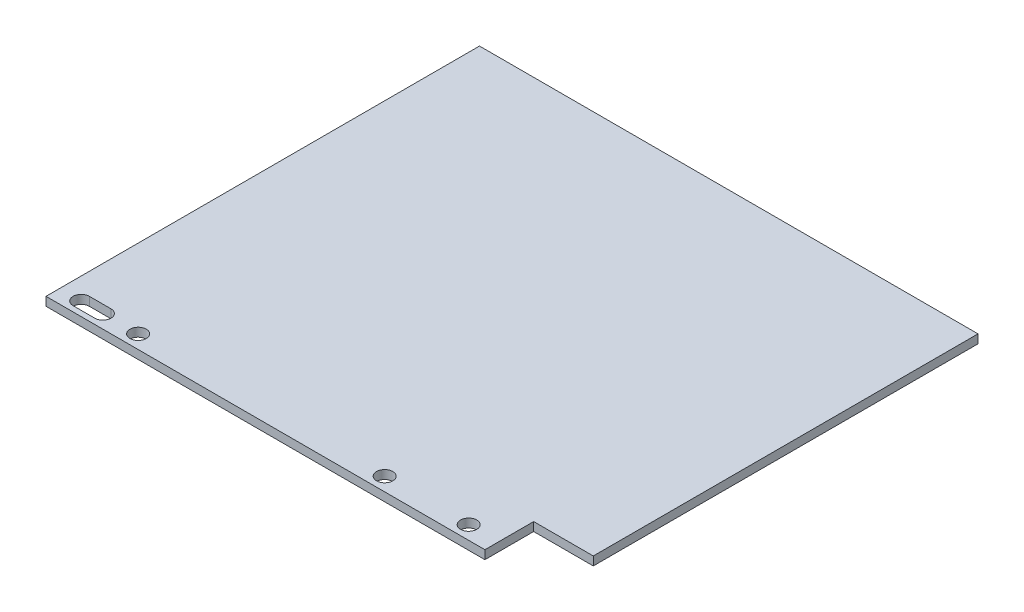
ISO-10303-21;
HEADER;
FILE_DESCRIPTION(('STEP AP214'),'2;1');
FILE_NAME('part.step','',(''),(''),'','','');
FILE_SCHEMA(('AUTOMOTIVE_DESIGN { 1 0 10303 214 1 1 1 1 }'));
ENDSEC;
DATA;
#1=APPLICATION_CONTEXT('core data for automotive mechanical design processes');
#2=APPLICATION_PROTOCOL_DEFINITION('international standard','automotive_design',2000,#1);
#3=PRODUCT_CONTEXT('',#1,'mechanical');
#4=PRODUCT('Part','Part','',(#3));
#5=PRODUCT_RELATED_PRODUCT_CATEGORY('part','',(#4));
#6=PRODUCT_DEFINITION_FORMATION('','',#4);
#7=PRODUCT_DEFINITION_CONTEXT('part definition',#1,'design');
#8=PRODUCT_DEFINITION('design','',#6,#7);
#9=PRODUCT_DEFINITION_SHAPE('','',#8);
#10=(LENGTH_UNIT() NAMED_UNIT(*) SI_UNIT(.MILLI.,.METRE.));
#11=(NAMED_UNIT(*) PLANE_ANGLE_UNIT() SI_UNIT($,.RADIAN.));
#12=(NAMED_UNIT(*) SI_UNIT($,.STERADIAN.) SOLID_ANGLE_UNIT());
#13=UNCERTAINTY_MEASURE_WITH_UNIT(LENGTH_MEASURE(1.E-05),#10,'distance_accuracy_value','');
#14=(GEOMETRIC_REPRESENTATION_CONTEXT(3) GLOBAL_UNCERTAINTY_ASSIGNED_CONTEXT((#13)) GLOBAL_UNIT_ASSIGNED_CONTEXT((#10,
#11,#12)) REPRESENTATION_CONTEXT('',''));
#15=CARTESIAN_POINT('',(0.,0.,0.));
#16=DIRECTION('',(0.,0.,1.));
#17=DIRECTION('',(1.,0.,0.));
#18=AXIS2_PLACEMENT_3D('',#15,#16,#17);
#19=CARTESIAN_POINT('',(0.,1.6,0.));
#20=DIRECTION('',(0.,1.,0.));
#21=DIRECTION('',(0.,0.,1.));
#22=AXIS2_PLACEMENT_3D('',#19,#20,#21);
#23=PLANE('',#22);
#24=CARTESIAN_POINT('',(14.,1.6,35.308269534664));
#25=DIRECTION('',(0.,1.,0.));
#26=DIRECTION('',(0.,0.,1.));
#27=AXIS2_PLACEMENT_3D('',#24,#25,#26);
#28=CIRCLE('',#27,1.5);
#29=CARTESIAN_POINT('',(14.,1.6,36.808269534664));
#30=VERTEX_POINT('',#29);
#31=EDGE_CURVE('E151',#30,#30,#28,.T.);
#32=ORIENTED_EDGE('',*,*,#31,.F.);
#33=EDGE_LOOP('',(#32));
#34=FACE_BOUND('',#33,.T.);
#35=DIRECTION('',(0.,0.,1.));
#36=VECTOR('',#35,1.);
#37=CARTESIAN_POINT('',(-46.,1.6,37.808269534664));
#38=LINE('',#37,#36);
#39=CARTESIAN_POINT('',(-46.,1.6,-42.191730465336));
#40=VERTEX_POINT('',#39);
#41=CARTESIAN_POINT('',(-46.,1.6,37.808269534664));
#42=VERTEX_POINT('',#41);
#43=EDGE_CURVE('E163',#40,#42,#38,.T.);
#44=ORIENTED_EDGE('',*,*,#43,.T.);
#45=DIRECTION('',(1.,0.,0.));
#46=VECTOR('',#45,1.);
#47=CARTESIAN_POINT('',(35.,1.6,37.808269534664));
#48=LINE('',#47,#46);
#49=CARTESIAN_POINT('',(35.,1.6,37.808269534664));
#50=VERTEX_POINT('',#49);
#51=EDGE_CURVE('E166',#42,#50,#48,.T.);
#52=ORIENTED_EDGE('',*,*,#51,.T.);
#53=DIRECTION('',(0.,0.,-1.));
#54=VECTOR('',#53,1.);
#55=CARTESIAN_POINT('',(35.,1.6,28.808269534664));
#56=LINE('',#55,#54);
#57=CARTESIAN_POINT('',(35.,1.6,28.808269534664));
#58=VERTEX_POINT('',#57);
#59=EDGE_CURVE('E169',#50,#58,#56,.T.);
#60=ORIENTED_EDGE('',*,*,#59,.T.);
#61=DIRECTION('',(1.,0.,0.));
#62=VECTOR('',#61,1.);
#63=CARTESIAN_POINT('',(46.,1.6,28.808269534664));
#64=LINE('',#63,#62);
#65=CARTESIAN_POINT('',(46.,1.6,28.808269534664));
#66=VERTEX_POINT('',#65);
#67=EDGE_CURVE('E171',#58,#66,#64,.T.);
#68=ORIENTED_EDGE('',*,*,#67,.T.);
#69=DIRECTION('',(0.,0.,-1.));
#70=VECTOR('',#69,1.);
#71=CARTESIAN_POINT('',(46.,1.6,28.808269534664));
#72=LINE('',#71,#70);
#73=CARTESIAN_POINT('',(46.,1.6,-42.191730465336));
#74=VERTEX_POINT('',#73);
#75=EDGE_CURVE('E173',#66,#74,#72,.T.);
#76=ORIENTED_EDGE('',*,*,#75,.T.);
#77=DIRECTION('',(-1.,0.,0.));
#78=VECTOR('',#77,1.);
#79=CARTESIAN_POINT('',(46.,1.6,-42.191730465336));
#80=LINE('',#79,#78);
#81=EDGE_CURVE('E175',#74,#40,#80,.T.);
#82=ORIENTED_EDGE('',*,*,#81,.T.);
#83=EDGE_LOOP('',(#44,#52,#60,#68,#76,#82));
#84=FACE_BOUND('',#83,.T.);
#85=CARTESIAN_POINT('',(29.5,1.6,35.308269534664));
#86=DIRECTION('',(0.,1.,0.));
#87=DIRECTION('',(0.,0.,1.));
#88=AXIS2_PLACEMENT_3D('',#85,#86,#87);
#89=CIRCLE('',#88,1.5);
#90=CARTESIAN_POINT('',(29.5,1.6,36.808269534664));
#91=VERTEX_POINT('',#90);
#92=EDGE_CURVE('E157',#91,#91,#89,.T.);
#93=ORIENTED_EDGE('',*,*,#92,.F.);
#94=EDGE_LOOP('',(#93));
#95=FACE_BOUND('',#94,.T.);
#96=CARTESIAN_POINT('',(-31.5,1.6,35.308269534664));
#97=DIRECTION('',(0.,1.,0.));
#98=DIRECTION('',(0.,0.,1.));
#99=AXIS2_PLACEMENT_3D('',#96,#97,#98);
#100=CIRCLE('',#99,1.5);
#101=CARTESIAN_POINT('',(-31.5,1.6,36.808269534664));
#102=VERTEX_POINT('',#101);
#103=EDGE_CURVE('E145',#102,#102,#100,.T.);
#104=ORIENTED_EDGE('',*,*,#103,.F.);
#105=EDGE_LOOP('',(#104));
#106=FACE_BOUND('',#105,.T.);
#107=DIRECTION('',(-1.,0.,0.));
#108=VECTOR('',#107,1.);
#109=CARTESIAN_POINT('',(-38.,1.6,33.808269534664));
#110=LINE('',#109,#108);
#111=CARTESIAN_POINT('',(-38.,1.6,33.808269534664));
#112=VERTEX_POINT('',#111);
#113=CARTESIAN_POINT('',(-42.,1.6,33.808269534664));
#114=VERTEX_POINT('',#113);
#115=EDGE_CURVE('E117',#112,#114,#110,.T.);
#116=ORIENTED_EDGE('',*,*,#115,.F.);
#117=CARTESIAN_POINT('',(-38.,1.6,35.308269534664));
#118=DIRECTION('',(0.,1.,0.));
#119=DIRECTION('',(0.,0.,1.));
#120=AXIS2_PLACEMENT_3D('',#117,#118,#119);
#121=CIRCLE('',#120,1.5);
#122=CARTESIAN_POINT('',(-38.,1.6,36.808269534664));
#123=VERTEX_POINT('',#122);
#124=EDGE_CURVE('E109',#123,#112,#121,.T.);
#125=ORIENTED_EDGE('',*,*,#124,.F.);
#126=DIRECTION('',(1.,0.,0.));
#127=VECTOR('',#126,1.);
#128=CARTESIAN_POINT('',(-38.,1.6,36.808269534664));
#129=LINE('',#128,#127);
#130=CARTESIAN_POINT('',(-42.,1.6,36.808269534664));
#131=VERTEX_POINT('',#130);
#132=EDGE_CURVE('E131',#131,#123,#129,.T.);
#133=ORIENTED_EDGE('',*,*,#132,.F.);
#134=CARTESIAN_POINT('',(-42.,1.6,35.308269534664));
#135=DIRECTION('',(0.,1.,0.));
#136=DIRECTION('',(0.,0.,1.));
#137=AXIS2_PLACEMENT_3D('',#134,#135,#136);
#138=CIRCLE('',#137,1.5);
#139=EDGE_CURVE('E129',#114,#131,#138,.T.);
#140=ORIENTED_EDGE('',*,*,#139,.F.);
#141=EDGE_LOOP('',(#116,#125,#133,#140));
#142=FACE_BOUND('',#141,.T.);
#143=ADVANCED_FACE('F32',(#34,#84,#95,#106,#142),#23,.T.);
#144=CARTESIAN_POINT('',(0.,0.,0.));
#145=DIRECTION('',(0.,1.,0.));
#146=DIRECTION('',(0.,0.,1.));
#147=AXIS2_PLACEMENT_3D('',#144,#145,#146);
#148=PLANE('',#147);
#149=CARTESIAN_POINT('',(-31.5,0.,35.308269534664));
#150=DIRECTION('',(0.,1.,0.));
#151=DIRECTION('',(0.,0.,1.));
#152=AXIS2_PLACEMENT_3D('',#149,#150,#151);
#153=CIRCLE('',#152,1.5);
#154=CARTESIAN_POINT('',(-31.5,0.,36.808269534664));
#155=VERTEX_POINT('',#154);
#156=EDGE_CURVE('E125',#155,#155,#153,.T.);
#157=ORIENTED_EDGE('',*,*,#156,.T.);
#158=EDGE_LOOP('',(#157));
#159=FACE_BOUND('',#158,.T.);
#160=CARTESIAN_POINT('',(14.,0.,35.308269534664));
#161=DIRECTION('',(0.,1.,0.));
#162=DIRECTION('',(0.,0.,1.));
#163=AXIS2_PLACEMENT_3D('',#160,#161,#162);
#164=CIRCLE('',#163,1.5);
#165=CARTESIAN_POINT('',(14.,0.,36.808269534664));
#166=VERTEX_POINT('',#165);
#167=EDGE_CURVE('E148',#166,#166,#164,.T.);
#168=ORIENTED_EDGE('',*,*,#167,.T.);
#169=EDGE_LOOP('',(#168));
#170=FACE_BOUND('',#169,.T.);
#171=CARTESIAN_POINT('',(29.5,0.,35.308269534664));
#172=DIRECTION('',(0.,1.,0.));
#173=DIRECTION('',(0.,0.,1.));
#174=AXIS2_PLACEMENT_3D('',#171,#172,#173);
#175=CIRCLE('',#174,1.5);
#176=CARTESIAN_POINT('',(29.5,0.,36.808269534664));
#177=VERTEX_POINT('',#176);
#178=EDGE_CURVE('E154',#177,#177,#175,.T.);
#179=ORIENTED_EDGE('',*,*,#178,.T.);
#180=EDGE_LOOP('',(#179));
#181=FACE_BOUND('',#180,.T.);
#182=DIRECTION('',(0.,0.,1.));
#183=VECTOR('',#182,1.);
#184=CARTESIAN_POINT('',(-46.,0.,37.808269534664));
#185=LINE('',#184,#183);
#186=CARTESIAN_POINT('',(-46.,0.,-42.191730465336));
#187=VERTEX_POINT('',#186);
#188=CARTESIAN_POINT('',(-46.,0.,37.808269534664));
#189=VERTEX_POINT('',#188);
#190=EDGE_CURVE('E160',#187,#189,#185,.T.);
#191=ORIENTED_EDGE('',*,*,#190,.F.);
#192=DIRECTION('',(-1.,0.,0.));
#193=VECTOR('',#192,1.);
#194=CARTESIAN_POINT('',(46.,0.,-42.191730465336));
#195=LINE('',#194,#193);
#196=CARTESIAN_POINT('',(46.,0.,-42.191730465336));
#197=VERTEX_POINT('',#196);
#198=EDGE_CURVE('E167',#197,#187,#195,.T.);
#199=ORIENTED_EDGE('',*,*,#198,.F.);
#200=DIRECTION('',(0.,0.,-1.));
#201=VECTOR('',#200,1.);
#202=CARTESIAN_POINT('',(46.,0.,28.808269534664));
#203=LINE('',#202,#201);
#204=CARTESIAN_POINT('',(46.,0.,28.808269534664));
#205=VERTEX_POINT('',#204);
#206=EDGE_CURVE('E186',#205,#197,#203,.T.);
#207=ORIENTED_EDGE('',*,*,#206,.F.);
#208=DIRECTION('',(1.,0.,0.));
#209=VECTOR('',#208,1.);
#210=CARTESIAN_POINT('',(46.,0.,28.808269534664));
#211=LINE('',#210,#209);
#212=CARTESIAN_POINT('',(35.,0.,28.808269534664));
#213=VERTEX_POINT('',#212);
#214=EDGE_CURVE('E184',#213,#205,#211,.T.);
#215=ORIENTED_EDGE('',*,*,#214,.F.);
#216=DIRECTION('',(0.,0.,-1.));
#217=VECTOR('',#216,1.);
#218=CARTESIAN_POINT('',(35.,0.,28.808269534664));
#219=LINE('',#218,#217);
#220=CARTESIAN_POINT('',(35.,0.,37.808269534664));
#221=VERTEX_POINT('',#220);
#222=EDGE_CURVE('E182',#221,#213,#219,.T.);
#223=ORIENTED_EDGE('',*,*,#222,.F.);
#224=DIRECTION('',(1.,0.,0.));
#225=VECTOR('',#224,1.);
#226=CARTESIAN_POINT('',(35.,0.,37.808269534664));
#227=LINE('',#226,#225);
#228=EDGE_CURVE('E180',#189,#221,#227,.T.);
#229=ORIENTED_EDGE('',*,*,#228,.F.);
#230=EDGE_LOOP('',(#191,#199,#207,#215,#223,#229));
#231=FACE_BOUND('',#230,.T.);
#232=CARTESIAN_POINT('',(-38.,0.,35.308269534664));
#233=DIRECTION('',(0.,1.,0.));
#234=DIRECTION('',(0.,0.,1.));
#235=AXIS2_PLACEMENT_3D('',#232,#233,#234);
#236=CIRCLE('',#235,1.5);
#237=CARTESIAN_POINT('',(-38.,0.,36.808269534664));
#238=VERTEX_POINT('',#237);
#239=CARTESIAN_POINT('',(-38.,0.,33.808269534664));
#240=VERTEX_POINT('',#239);
#241=EDGE_CURVE('E55',#238,#240,#236,.T.);
#242=ORIENTED_EDGE('',*,*,#241,.T.);
#243=DIRECTION('',(-1.,0.,0.));
#244=VECTOR('',#243,1.);
#245=CARTESIAN_POINT('',(-38.,0.,33.808269534664));
#246=LINE('',#245,#244);
#247=CARTESIAN_POINT('',(-42.,0.,33.808269534664));
#248=VERTEX_POINT('',#247);
#249=EDGE_CURVE('E124',#240,#248,#246,.T.);
#250=ORIENTED_EDGE('',*,*,#249,.T.);
#251=CARTESIAN_POINT('',(-42.,0.,35.308269534664));
#252=DIRECTION('',(0.,1.,0.));
#253=DIRECTION('',(0.,0.,1.));
#254=AXIS2_PLACEMENT_3D('',#251,#252,#253);
#255=CIRCLE('',#254,1.5);
#256=CARTESIAN_POINT('',(-42.,0.,36.808269534664));
#257=VERTEX_POINT('',#256);
#258=EDGE_CURVE('E137',#248,#257,#255,.T.);
#259=ORIENTED_EDGE('',*,*,#258,.T.);
#260=DIRECTION('',(1.,0.,0.));
#261=VECTOR('',#260,1.);
#262=CARTESIAN_POINT('',(-38.,0.,36.808269534664));
#263=LINE('',#262,#261);
#264=EDGE_CURVE('E118',#257,#238,#263,.T.);
#265=ORIENTED_EDGE('',*,*,#264,.T.);
#266=EDGE_LOOP('',(#242,#250,#259,#265));
#267=FACE_BOUND('',#266,.T.);
#268=ADVANCED_FACE('F210',(#159,#170,#181,#231,#267),#148,.F.);
#269=CARTESIAN_POINT('',(-46.,1.6,37.808269534664));
#270=DIRECTION('',(1.,0.,0.));
#271=DIRECTION('',(0.,0.,-1.));
#272=AXIS2_PLACEMENT_3D('',#269,#270,#271);
#273=PLANE('',#272);
#274=ORIENTED_EDGE('',*,*,#190,.T.);
#275=DIRECTION('',(0.,-1.,0.));
#276=VECTOR('',#275,1.);
#277=CARTESIAN_POINT('',(-46.,1.6,37.808269534664));
#278=LINE('',#277,#276);
#279=EDGE_CURVE('E11',#42,#189,#278,.T.);
#280=ORIENTED_EDGE('',*,*,#279,.F.);
#281=ORIENTED_EDGE('',*,*,#43,.F.);
#282=DIRECTION('',(0.,-1.,0.));
#283=VECTOR('',#282,1.);
#284=CARTESIAN_POINT('',(-46.,1.6,-42.191730465336));
#285=LINE('',#284,#283);
#286=EDGE_CURVE('E177',#40,#187,#285,.T.);
#287=ORIENTED_EDGE('',*,*,#286,.T.);
#288=EDGE_LOOP('',(#274,#280,#281,#287));
#289=FACE_BOUND('',#288,.T.);
#290=ADVANCED_FACE('F34',(#289),#273,.F.);
#291=CARTESIAN_POINT('',(35.,1.6,37.808269534664));
#292=DIRECTION('',(0.,0.,-1.));
#293=DIRECTION('',(-1.,0.,0.));
#294=AXIS2_PLACEMENT_3D('',#291,#292,#293);
#295=PLANE('',#294);
#296=ORIENTED_EDGE('',*,*,#228,.T.);
#297=DIRECTION('',(0.,-1.,0.));
#298=VECTOR('',#297,1.);
#299=CARTESIAN_POINT('',(35.,1.6,37.808269534664));
#300=LINE('',#299,#298);
#301=EDGE_CURVE('E40',#50,#221,#300,.T.);
#302=ORIENTED_EDGE('',*,*,#301,.F.);
#303=ORIENTED_EDGE('',*,*,#51,.F.);
#304=ORIENTED_EDGE('',*,*,#279,.T.);
#305=EDGE_LOOP('',(#296,#302,#303,#304));
#306=FACE_BOUND('',#305,.T.);
#307=ADVANCED_FACE('F228',(#306),#295,.F.);
#308=CARTESIAN_POINT('',(35.,1.6,28.808269534664));
#309=DIRECTION('',(-1.,0.,0.));
#310=DIRECTION('',(0.,0.,1.));
#311=AXIS2_PLACEMENT_3D('',#308,#309,#310);
#312=PLANE('',#311);
#313=ORIENTED_EDGE('',*,*,#222,.T.);
#314=DIRECTION('',(0.,-1.,0.));
#315=VECTOR('',#314,1.);
#316=CARTESIAN_POINT('',(35.,1.6,28.808269534664));
#317=LINE('',#316,#315);
#318=EDGE_CURVE('E197',#58,#213,#317,.T.);
#319=ORIENTED_EDGE('',*,*,#318,.F.);
#320=ORIENTED_EDGE('',*,*,#59,.F.);
#321=ORIENTED_EDGE('',*,*,#301,.T.);
#322=EDGE_LOOP('',(#313,#319,#320,#321));
#323=FACE_BOUND('',#322,.T.);
#324=ADVANCED_FACE('F204',(#323),#312,.F.);
#325=CARTESIAN_POINT('',(46.,1.6,28.808269534664));
#326=DIRECTION('',(0.,0.,-1.));
#327=DIRECTION('',(-1.,0.,0.));
#328=AXIS2_PLACEMENT_3D('',#325,#326,#327);
#329=PLANE('',#328);
#330=ORIENTED_EDGE('',*,*,#214,.T.);
#331=DIRECTION('',(0.,-1.,0.));
#332=VECTOR('',#331,1.);
#333=CARTESIAN_POINT('',(46.,1.6,28.808269534664));
#334=LINE('',#333,#332);
#335=EDGE_CURVE('E194',#66,#205,#334,.T.);
#336=ORIENTED_EDGE('',*,*,#335,.F.);
#337=ORIENTED_EDGE('',*,*,#67,.F.);
#338=ORIENTED_EDGE('',*,*,#318,.T.);
#339=EDGE_LOOP('',(#330,#336,#337,#338));
#340=FACE_BOUND('',#339,.T.);
#341=ADVANCED_FACE('F216',(#340),#329,.F.);
#342=CARTESIAN_POINT('',(46.,1.6,28.808269534664));
#343=DIRECTION('',(-1.,0.,0.));
#344=DIRECTION('',(0.,0.,1.));
#345=AXIS2_PLACEMENT_3D('',#342,#343,#344);
#346=PLANE('',#345);
#347=ORIENTED_EDGE('',*,*,#206,.T.);
#348=DIRECTION('',(0.,-1.,0.));
#349=VECTOR('',#348,1.);
#350=CARTESIAN_POINT('',(46.,1.6,-42.191730465336));
#351=LINE('',#350,#349);
#352=EDGE_CURVE('E191',#74,#197,#351,.T.);
#353=ORIENTED_EDGE('',*,*,#352,.F.);
#354=ORIENTED_EDGE('',*,*,#75,.F.);
#355=ORIENTED_EDGE('',*,*,#335,.T.);
#356=EDGE_LOOP('',(#347,#353,#354,#355));
#357=FACE_BOUND('',#356,.T.);
#358=ADVANCED_FACE('F220',(#357),#346,.F.);
#359=CARTESIAN_POINT('',(46.,1.6,-42.191730465336));
#360=DIRECTION('',(0.,0.,1.));
#361=DIRECTION('',(1.,0.,0.));
#362=AXIS2_PLACEMENT_3D('',#359,#360,#361);
#363=PLANE('',#362);
#364=ORIENTED_EDGE('',*,*,#198,.T.);
#365=ORIENTED_EDGE('',*,*,#286,.F.);
#366=ORIENTED_EDGE('',*,*,#81,.F.);
#367=ORIENTED_EDGE('',*,*,#352,.T.);
#368=EDGE_LOOP('',(#364,#365,#366,#367));
#369=FACE_BOUND('',#368,.T.);
#370=ADVANCED_FACE('F231',(#369),#363,.F.);
#371=CARTESIAN_POINT('',(29.5,1.6,35.308269534664));
#372=DIRECTION('',(0.,-1.,0.));
#373=DIRECTION('',(0.,0.,-1.));
#374=AXIS2_PLACEMENT_3D('',#371,#372,#373);
#375=CYLINDRICAL_SURFACE('',#374,1.5);
#376=ORIENTED_EDGE('',*,*,#92,.T.);
#377=EDGE_LOOP('',(#376));
#378=FACE_BOUND('',#377,.T.);
#379=ORIENTED_EDGE('',*,*,#178,.F.);
#380=EDGE_LOOP('',(#379));
#381=FACE_BOUND('',#380,.T.);
#382=ADVANCED_FACE('F233',(#378,#381),#375,.F.);
#383=CARTESIAN_POINT('',(14.,1.6,35.308269534664));
#384=DIRECTION('',(0.,-1.,0.));
#385=DIRECTION('',(0.,0.,-1.));
#386=AXIS2_PLACEMENT_3D('',#383,#384,#385);
#387=CYLINDRICAL_SURFACE('',#386,1.5);
#388=ORIENTED_EDGE('',*,*,#31,.T.);
#389=EDGE_LOOP('',(#388));
#390=FACE_BOUND('',#389,.T.);
#391=ORIENTED_EDGE('',*,*,#167,.F.);
#392=EDGE_LOOP('',(#391));
#393=FACE_BOUND('',#392,.T.);
#394=ADVANCED_FACE('F239',(#390,#393),#387,.F.);
#395=CARTESIAN_POINT('',(-31.5,1.6,35.308269534664));
#396=DIRECTION('',(0.,-1.,0.));
#397=DIRECTION('',(0.,0.,-1.));
#398=AXIS2_PLACEMENT_3D('',#395,#396,#397);
#399=CYLINDRICAL_SURFACE('',#398,1.5);
#400=ORIENTED_EDGE('',*,*,#103,.T.);
#401=EDGE_LOOP('',(#400));
#402=FACE_BOUND('',#401,.T.);
#403=ORIENTED_EDGE('',*,*,#156,.F.);
#404=EDGE_LOOP('',(#403));
#405=FACE_BOUND('',#404,.T.);
#406=ADVANCED_FACE('F255',(#402,#405),#399,.F.);
#407=CARTESIAN_POINT('',(-38.,1.6,35.308269534664));
#408=DIRECTION('',(0.,-1.,0.));
#409=DIRECTION('',(0.,0.,-1.));
#410=AXIS2_PLACEMENT_3D('',#407,#408,#409);
#411=CYLINDRICAL_SURFACE('',#410,1.5);
#412=ORIENTED_EDGE('',*,*,#241,.F.);
#413=DIRECTION('',(0.,-1.,0.));
#414=VECTOR('',#413,1.);
#415=CARTESIAN_POINT('',(-38.,1.6,36.808269534664));
#416=LINE('',#415,#414);
#417=EDGE_CURVE('E113',#123,#238,#416,.T.);
#418=ORIENTED_EDGE('',*,*,#417,.F.);
#419=ORIENTED_EDGE('',*,*,#124,.T.);
#420=DIRECTION('',(0.,-1.,0.));
#421=VECTOR('',#420,1.);
#422=CARTESIAN_POINT('',(-38.,1.6,33.808269534664));
#423=LINE('',#422,#421);
#424=EDGE_CURVE('E112',#112,#240,#423,.T.);
#425=ORIENTED_EDGE('',*,*,#424,.T.);
#426=EDGE_LOOP('',(#412,#418,#419,#425));
#427=FACE_BOUND('',#426,.T.);
#428=ADVANCED_FACE('F111',(#427),#411,.F.);
#429=CARTESIAN_POINT('',(-38.,1.6,33.808269534664));
#430=DIRECTION('',(0.,0.,1.));
#431=DIRECTION('',(1.,0.,0.));
#432=AXIS2_PLACEMENT_3D('',#429,#430,#431);
#433=PLANE('',#432);
#434=ORIENTED_EDGE('',*,*,#249,.F.);
#435=ORIENTED_EDGE('',*,*,#424,.F.);
#436=ORIENTED_EDGE('',*,*,#115,.T.);
#437=DIRECTION('',(0.,-1.,0.));
#438=VECTOR('',#437,1.);
#439=CARTESIAN_POINT('',(-42.,1.6,33.808269534664));
#440=LINE('',#439,#438);
#441=EDGE_CURVE('E126',#114,#248,#440,.T.);
#442=ORIENTED_EDGE('',*,*,#441,.T.);
#443=EDGE_LOOP('',(#434,#435,#436,#442));
#444=FACE_BOUND('',#443,.T.);
#445=ADVANCED_FACE('F121',(#444),#433,.T.);
#446=CARTESIAN_POINT('',(-42.,1.6,35.308269534664));
#447=DIRECTION('',(0.,-1.,0.));
#448=DIRECTION('',(0.,0.,-1.));
#449=AXIS2_PLACEMENT_3D('',#446,#447,#448);
#450=CYLINDRICAL_SURFACE('',#449,1.5);
#451=ORIENTED_EDGE('',*,*,#258,.F.);
#452=ORIENTED_EDGE('',*,*,#441,.F.);
#453=ORIENTED_EDGE('',*,*,#139,.T.);
#454=DIRECTION('',(0.,-1.,0.));
#455=VECTOR('',#454,1.);
#456=CARTESIAN_POINT('',(-42.,1.6,36.808269534664));
#457=LINE('',#456,#455);
#458=EDGE_CURVE('E47',#131,#257,#457,.T.);
#459=ORIENTED_EDGE('',*,*,#458,.T.);
#460=EDGE_LOOP('',(#451,#452,#453,#459));
#461=FACE_BOUND('',#460,.T.);
#462=ADVANCED_FACE('F264',(#461),#450,.F.);
#463=CARTESIAN_POINT('',(-38.,1.6,36.808269534664));
#464=DIRECTION('',(0.,0.,-1.));
#465=DIRECTION('',(-1.,0.,0.));
#466=AXIS2_PLACEMENT_3D('',#463,#464,#465);
#467=PLANE('',#466);
#468=ORIENTED_EDGE('',*,*,#264,.F.);
#469=ORIENTED_EDGE('',*,*,#458,.F.);
#470=ORIENTED_EDGE('',*,*,#132,.T.);
#471=ORIENTED_EDGE('',*,*,#417,.T.);
#472=EDGE_LOOP('',(#468,#469,#470,#471));
#473=FACE_BOUND('',#472,.T.);
#474=ADVANCED_FACE('F267',(#473),#467,.T.);
#475=CLOSED_SHELL('',(#143,#268,#290,#307,#324,#341,#358,#370,#382,#394,#406,#428,#445,#462,#474));
#476=MANIFOLD_SOLID_BREP('B2',#475);
#477=ADVANCED_BREP_SHAPE_REPRESENTATION('',(#18,#476),#14);
#478=SHAPE_DEFINITION_REPRESENTATION(#9,#477);
ENDSEC;
END-ISO-10303-21;
